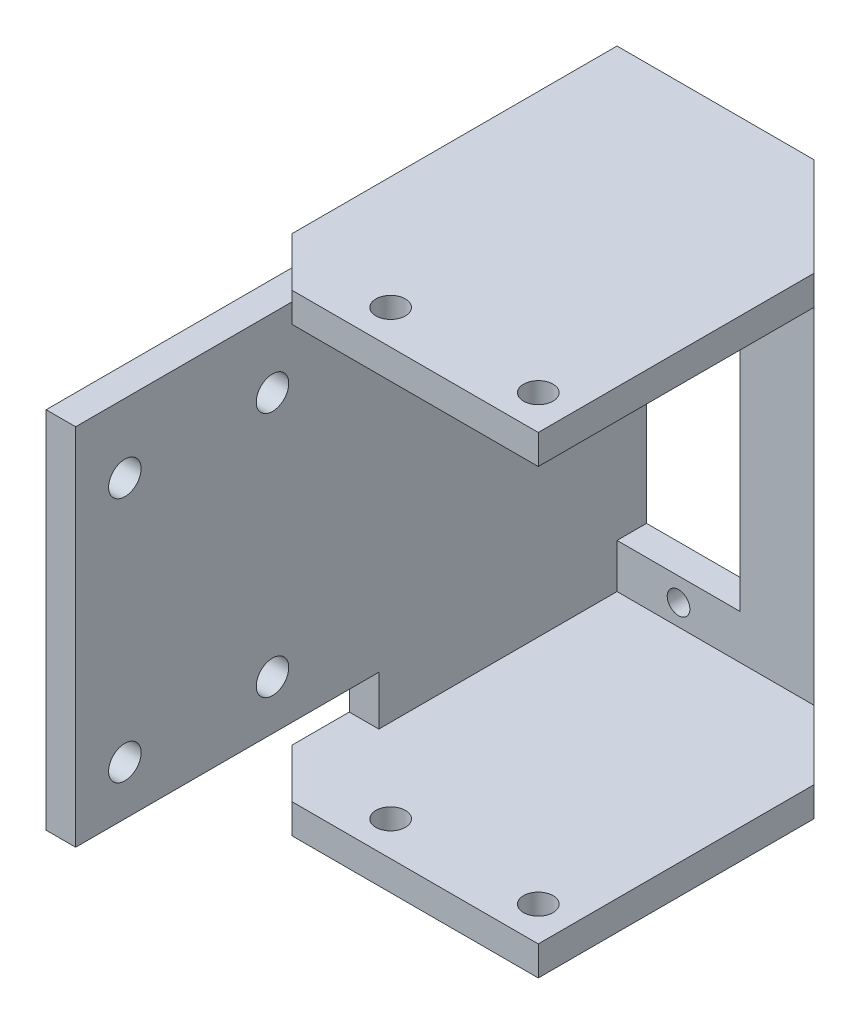
ISO-10303-21;
HEADER;
FILE_DESCRIPTION(('STEP AP214'),'2;1');
FILE_NAME('part.step','',(''),(''),'','','');
FILE_SCHEMA(('AUTOMOTIVE_DESIGN { 1 0 10303 214 1 1 1 1 }'));
ENDSEC;
DATA;
#1=APPLICATION_CONTEXT('core data for automotive mechanical design processes');
#2=APPLICATION_PROTOCOL_DEFINITION('international standard','automotive_design',2000,#1);
#3=PRODUCT_CONTEXT('',#1,'mechanical');
#4=PRODUCT('Part','Part','',(#3));
#5=PRODUCT_RELATED_PRODUCT_CATEGORY('part','',(#4));
#6=PRODUCT_DEFINITION_FORMATION('','',#4);
#7=PRODUCT_DEFINITION_CONTEXT('part definition',#1,'design');
#8=PRODUCT_DEFINITION('design','',#6,#7);
#9=PRODUCT_DEFINITION_SHAPE('','',#8);
#10=(LENGTH_UNIT() NAMED_UNIT(*) SI_UNIT(.MILLI.,.METRE.));
#11=(NAMED_UNIT(*) PLANE_ANGLE_UNIT() SI_UNIT($,.RADIAN.));
#12=(NAMED_UNIT(*) SI_UNIT($,.STERADIAN.) SOLID_ANGLE_UNIT());
#13=UNCERTAINTY_MEASURE_WITH_UNIT(LENGTH_MEASURE(1.E-05),#10,'distance_accuracy_value','');
#14=(GEOMETRIC_REPRESENTATION_CONTEXT(3) GLOBAL_UNCERTAINTY_ASSIGNED_CONTEXT((#13)) GLOBAL_UNIT_ASSIGNED_CONTEXT((#10,
#11,#12)) REPRESENTATION_CONTEXT('',''));
#15=CARTESIAN_POINT('',(0.,0.,0.));
#16=DIRECTION('',(0.,0.,1.));
#17=DIRECTION('',(1.,0.,0.));
#18=AXIS2_PLACEMENT_3D('',#15,#16,#17);
#19=CARTESIAN_POINT('',(0.,0.,3.));
#20=DIRECTION('',(0.,0.,-1.));
#21=DIRECTION('',(-1.,0.,0.));
#22=AXIS2_PLACEMENT_3D('',#19,#20,#21);
#23=PLANE('',#22);
#24=DIRECTION('',(0.,1.,0.));
#25=VECTOR('',#24,1.);
#26=CARTESIAN_POINT('',(15.5,7.49999999999995,3.));
#27=LINE('',#26,#25);
#28=CARTESIAN_POINT('',(15.5,7.49999999999995,3.));
#29=VERTEX_POINT('',#28);
#30=CARTESIAN_POINT('',(15.5,30.4999999999999,3.));
#31=VERTEX_POINT('',#30);
#32=EDGE_CURVE('E278',#29,#31,#27,.T.);
#33=ORIENTED_EDGE('',*,*,#32,.F.);
#34=DIRECTION('',(1.,0.,0.));
#35=VECTOR('',#34,1.);
#36=CARTESIAN_POINT('',(15.5,7.49999999999995,3.));
#37=LINE('',#36,#35);
#38=CARTESIAN_POINT('',(3.00000000000008,7.49999999999995,3.));
#39=VERTEX_POINT('',#38);
#40=EDGE_CURVE('E285',#39,#29,#37,.T.);
#41=ORIENTED_EDGE('',*,*,#40,.F.);
#42=DIRECTION('',(0.,1.,0.));
#43=VECTOR('',#42,1.);
#44=CARTESIAN_POINT('',(3.00000000000008,3.,3.));
#45=LINE('',#44,#43);
#46=CARTESIAN_POINT('',(3.00000000000008,3.,3.));
#47=VERTEX_POINT('',#46);
#48=EDGE_CURVE('E331',#47,#39,#45,.T.);
#49=ORIENTED_EDGE('',*,*,#48,.F.);
#50=DIRECTION('',(-1.,0.,0.));
#51=VECTOR('',#50,1.);
#52=CARTESIAN_POINT('',(0.,3.,3.));
#53=LINE('',#52,#51);
#54=CARTESIAN_POINT('',(22.9999999999999,3.,3.));
#55=VERTEX_POINT('',#54);
#56=EDGE_CURVE('E386',#55,#47,#53,.T.);
#57=ORIENTED_EDGE('',*,*,#56,.F.);
#58=DIRECTION('',(0.,1.,0.));
#59=VECTOR('',#58,1.);
#60=CARTESIAN_POINT('',(22.9999999999999,0.,3.));
#61=LINE('',#60,#59);
#62=CARTESIAN_POINT('',(22.9999999999999,45.,3.));
#63=VERTEX_POINT('',#62);
#64=EDGE_CURVE('E348',#55,#63,#61,.T.);
#65=ORIENTED_EDGE('',*,*,#64,.T.);
#66=DIRECTION('',(1.,0.,0.));
#67=VECTOR('',#66,1.);
#68=CARTESIAN_POINT('',(0.,45.,3.));
#69=LINE('',#68,#67);
#70=CARTESIAN_POINT('',(3.00000000000008,45.,3.));
#71=VERTEX_POINT('',#70);
#72=EDGE_CURVE('E378',#71,#63,#69,.T.);
#73=ORIENTED_EDGE('',*,*,#72,.F.);
#74=CARTESIAN_POINT('',(3.00000000000008,30.4999999999999,3.));
#75=VERTEX_POINT('',#74);
#76=EDGE_CURVE('E330',#75,#71,#45,.T.);
#77=ORIENTED_EDGE('',*,*,#76,.F.);
#78=DIRECTION('',(-1.,0.,0.));
#79=VECTOR('',#78,1.);
#80=CARTESIAN_POINT('',(15.5,30.4999999999999,3.));
#81=LINE('',#80,#79);
#82=EDGE_CURVE('E283',#31,#75,#81,.T.);
#83=ORIENTED_EDGE('',*,*,#82,.F.);
#84=EDGE_LOOP('',(#33,#41,#49,#57,#65,#73,#77,#83));
#85=FACE_BOUND('',#84,.T.);
#86=CARTESIAN_POINT('',(9.24999999999998,32.85,3.));
#87=DIRECTION('',(0.,0.,1.));
#88=DIRECTION('',(1.,0.,0.));
#89=AXIS2_PLACEMENT_3D('',#86,#87,#88);
#90=CIRCLE('',#89,1.15);
#91=CARTESIAN_POINT('',(10.4,32.85,3.));
#92=VERTEX_POINT('',#91);
#93=EDGE_CURVE('E275',#92,#92,#90,.T.);
#94=ORIENTED_EDGE('',*,*,#93,.F.);
#95=EDGE_LOOP('',(#94));
#96=FACE_BOUND('',#95,.T.);
#97=CARTESIAN_POINT('',(9.24999999999998,5.14999999999995,3.));
#98=DIRECTION('',(0.,0.,1.));
#99=DIRECTION('',(1.,0.,0.));
#100=AXIS2_PLACEMENT_3D('',#97,#98,#99);
#101=CIRCLE('',#100,1.15);
#102=CARTESIAN_POINT('',(10.4,5.14999999999995,3.));
#103=VERTEX_POINT('',#102);
#104=EDGE_CURVE('E274',#103,#103,#101,.T.);
#105=ORIENTED_EDGE('',*,*,#104,.F.);
#106=EDGE_LOOP('',(#105));
#107=FACE_BOUND('',#106,.T.);
#108=DIRECTION('',(0.,-1.,0.));
#109=VECTOR('',#108,1.);
#110=CARTESIAN_POINT('',(6.37375600474519,35.5569230144234,3.));
#111=LINE('',#110,#109);
#112=CARTESIAN_POINT('',(6.37375600474519,40.231274425459,3.));
#113=VERTEX_POINT('',#112);
#114=CARTESIAN_POINT('',(6.37375600474519,35.5569230144234,3.));
#115=VERTEX_POINT('',#114);
#116=EDGE_CURVE('E226',#113,#115,#111,.T.);
#117=ORIENTED_EDGE('',*,*,#116,.F.);
#118=DIRECTION('',(-1.,0.,0.));
#119=VECTOR('',#118,1.);
#120=CARTESIAN_POINT('',(6.37375600474519,40.231274425459,3.));
#121=LINE('',#120,#119);
#122=CARTESIAN_POINT('',(11.928177846488,40.231274425459,3.));
#123=VERTEX_POINT('',#122);
#124=EDGE_CURVE('E223',#123,#113,#121,.T.);
#125=ORIENTED_EDGE('',*,*,#124,.F.);
#126=DIRECTION('',(0.,1.,0.));
#127=VECTOR('',#126,1.);
#128=CARTESIAN_POINT('',(11.928177846488,35.5569230144234,3.));
#129=LINE('',#128,#127);
#130=CARTESIAN_POINT('',(11.928177846488,35.5569230144234,3.));
#131=VERTEX_POINT('',#130);
#132=EDGE_CURVE('E61',#131,#123,#129,.T.);
#133=ORIENTED_EDGE('',*,*,#132,.F.);
#134=DIRECTION('',(1.,0.,0.));
#135=VECTOR('',#134,1.);
#136=CARTESIAN_POINT('',(6.37375600474519,35.5569230144234,3.));
#137=LINE('',#136,#135);
#138=EDGE_CURVE('E56',#115,#131,#137,.T.);
#139=ORIENTED_EDGE('',*,*,#138,.F.);
#140=EDGE_LOOP('',(#117,#125,#133,#139));
#141=FACE_BOUND('',#140,.T.);
#142=ADVANCED_FACE('F41',(#85,#96,#107,#141),#23,.F.);
#143=CARTESIAN_POINT('',(0.,3.,38.));
#144=DIRECTION('',(0.,-1.,0.));
#145=DIRECTION('',(0.,0.,-1.));
#146=AXIS2_PLACEMENT_3D('',#143,#144,#145);
#147=PLANE('',#146);
#148=CARTESIAN_POINT('',(26.5,3.,34.5));
#149=DIRECTION('',(0.,-1.,0.));
#150=DIRECTION('',(0.,0.,-1.));
#151=AXIS2_PLACEMENT_3D('',#148,#149,#150);
#152=CIRCLE('',#151,1.5);
#153=CARTESIAN_POINT('',(26.5,3.,33.));
#154=VERTEX_POINT('',#153);
#155=EDGE_CURVE('E256',#154,#154,#152,.T.);
#156=ORIENTED_EDGE('',*,*,#155,.T.);
#157=EDGE_LOOP('',(#156));
#158=FACE_BOUND('',#157,.T.);
#159=CARTESIAN_POINT('',(11.5,3.,34.5000000000003));
#160=DIRECTION('',(0.,-1.,0.));
#161=DIRECTION('',(0.,0.,-1.));
#162=AXIS2_PLACEMENT_3D('',#159,#160,#161);
#163=CIRCLE('',#162,1.5);
#164=CARTESIAN_POINT('',(11.5,3.,33.0000000000002));
#165=VERTEX_POINT('',#164);
#166=EDGE_CURVE('E250',#165,#165,#163,.T.);
#167=ORIENTED_EDGE('',*,*,#166,.T.);
#168=EDGE_LOOP('',(#167));
#169=FACE_BOUND('',#168,.T.);
#170=DIRECTION('',(0.,0.,-1.));
#171=VECTOR('',#170,1.);
#172=CARTESIAN_POINT('',(3.00000000000008,3.,28.));
#173=LINE('',#172,#171);
#174=CARTESIAN_POINT('',(3.00000000000008,3.,27.2));
#175=VERTEX_POINT('',#174);
#176=EDGE_CURVE('E337',#175,#47,#173,.T.);
#177=ORIENTED_EDGE('',*,*,#176,.F.);
#178=DIRECTION('',(-1.,0.,0.));
#179=VECTOR('',#178,1.);
#180=CARTESIAN_POINT('',(10.,3.,27.2));
#181=LINE('',#180,#179);
#182=CARTESIAN_POINT('',(0.,3.,27.2));
#183=VERTEX_POINT('',#182);
#184=EDGE_CURVE('E268',#175,#183,#181,.T.);
#185=ORIENTED_EDGE('',*,*,#184,.T.);
#186=DIRECTION('',(0.,0.,1.));
#187=VECTOR('',#186,1.);
#188=CARTESIAN_POINT('',(0.,3.,58.));
#189=LINE('',#188,#187);
#190=CARTESIAN_POINT('',(0.,3.,33.));
#191=VERTEX_POINT('',#190);
#192=EDGE_CURVE('E265',#183,#191,#189,.T.);
#193=ORIENTED_EDGE('',*,*,#192,.T.);
#194=DIRECTION('',(0.707106781186544,0.,0.707106781186551));
#195=VECTOR('',#194,1.);
#196=CARTESIAN_POINT('',(2.50000000000003,3.,35.5));
#197=LINE('',#196,#195);
#198=CARTESIAN_POINT('',(5.,3.,38.));
#199=VERTEX_POINT('',#198);
#200=EDGE_CURVE('E371',#191,#199,#197,.T.);
#201=ORIENTED_EDGE('',*,*,#200,.T.);
#202=DIRECTION('',(-1.,0.,0.));
#203=VECTOR('',#202,1.);
#204=CARTESIAN_POINT('',(0.,3.,38.));
#205=LINE('',#204,#203);
#206=CARTESIAN_POINT('',(30.,3.,38.));
#207=VERTEX_POINT('',#206);
#208=EDGE_CURVE('E392',#207,#199,#205,.T.);
#209=ORIENTED_EDGE('',*,*,#208,.F.);
#210=DIRECTION('',(0.,0.,-1.));
#211=VECTOR('',#210,1.);
#212=CARTESIAN_POINT('',(30.,3.,38.));
#213=LINE('',#212,#211);
#214=CARTESIAN_POINT('',(30.,3.,10.));
#215=VERTEX_POINT('',#214);
#216=EDGE_CURVE('E374',#207,#215,#213,.T.);
#217=ORIENTED_EDGE('',*,*,#216,.T.);
#218=DIRECTION('',(-0.707106781186551,0.,-0.707106781186544));
#219=VECTOR('',#218,1.);
#220=CARTESIAN_POINT('',(28.9999999999998,3.,8.99999999999986));
#221=LINE('',#220,#219);
#222=EDGE_CURVE('E353',#215,#55,#221,.T.);
#223=ORIENTED_EDGE('',*,*,#222,.T.);
#224=ORIENTED_EDGE('',*,*,#56,.T.);
#225=EDGE_LOOP('',(#177,#185,#193,#201,#209,#217,#223,#224));
#226=FACE_BOUND('',#225,.T.);
#227=ADVANCED_FACE('F491',(#158,#169,#226),#147,.F.);
#228=CARTESIAN_POINT('',(0.,45.,38.));
#229=DIRECTION('',(0.,1.,0.));
#230=DIRECTION('',(0.,0.,1.));
#231=AXIS2_PLACEMENT_3D('',#228,#229,#230);
#232=PLANE('',#231);
#233=CARTESIAN_POINT('',(26.5,45.,34.5));
#234=DIRECTION('',(0.,1.,0.));
#235=DIRECTION('',(0.,0.,1.));
#236=AXIS2_PLACEMENT_3D('',#233,#234,#235);
#237=CIRCLE('',#236,1.5);
#238=CARTESIAN_POINT('',(26.5,45.,36.));
#239=VERTEX_POINT('',#238);
#240=EDGE_CURVE('E253',#239,#239,#237,.T.);
#241=ORIENTED_EDGE('',*,*,#240,.T.);
#242=EDGE_LOOP('',(#241));
#243=FACE_BOUND('',#242,.T.);
#244=CARTESIAN_POINT('',(11.5,45.,34.5000000000003));
#245=DIRECTION('',(0.,1.,0.));
#246=DIRECTION('',(0.,0.,1.));
#247=AXIS2_PLACEMENT_3D('',#244,#245,#246);
#248=CIRCLE('',#247,1.5);
#249=CARTESIAN_POINT('',(11.5,45.,36.0000000000003));
#250=VERTEX_POINT('',#249);
#251=EDGE_CURVE('E239',#250,#250,#248,.T.);
#252=ORIENTED_EDGE('',*,*,#251,.T.);
#253=EDGE_LOOP('',(#252));
#254=FACE_BOUND('',#253,.T.);
#255=DIRECTION('',(-0.707106781186544,0.,-0.707106781186551));
#256=VECTOR('',#255,1.);
#257=CARTESIAN_POINT('',(2.50000000000003,45.,35.5));
#258=LINE('',#257,#256);
#259=CARTESIAN_POINT('',(5.,45.,38.));
#260=VERTEX_POINT('',#259);
#261=CARTESIAN_POINT('',(3.00000000000008,45.,36.0000000000001));
#262=VERTEX_POINT('',#261);
#263=EDGE_CURVE('E365',#260,#262,#258,.T.);
#264=ORIENTED_EDGE('',*,*,#263,.T.);
#265=DIRECTION('',(0.,0.,-1.));
#266=VECTOR('',#265,1.);
#267=CARTESIAN_POINT('',(3.00000000000008,45.,28.));
#268=LINE('',#267,#266);
#269=EDGE_CURVE('E334',#262,#71,#268,.T.);
#270=ORIENTED_EDGE('',*,*,#269,.T.);
#271=ORIENTED_EDGE('',*,*,#72,.T.);
#272=DIRECTION('',(0.707106781186551,0.,0.707106781186544));
#273=VECTOR('',#272,1.);
#274=CARTESIAN_POINT('',(28.9999999999998,45.,8.99999999999986));
#275=LINE('',#274,#273);
#276=CARTESIAN_POINT('',(30.,45.,10.));
#277=VERTEX_POINT('',#276);
#278=EDGE_CURVE('E418',#63,#277,#275,.T.);
#279=ORIENTED_EDGE('',*,*,#278,.T.);
#280=DIRECTION('',(0.,0.,-1.));
#281=VECTOR('',#280,1.);
#282=CARTESIAN_POINT('',(30.,45.,38.));
#283=LINE('',#282,#281);
#284=CARTESIAN_POINT('',(30.,45.,38.));
#285=VERTEX_POINT('',#284);
#286=EDGE_CURVE('E384',#285,#277,#283,.T.);
#287=ORIENTED_EDGE('',*,*,#286,.F.);
#288=DIRECTION('',(1.,0.,0.));
#289=VECTOR('',#288,1.);
#290=CARTESIAN_POINT('',(0.,45.,38.));
#291=LINE('',#290,#289);
#292=EDGE_CURVE('E375',#260,#285,#291,.T.);
#293=ORIENTED_EDGE('',*,*,#292,.F.);
#294=EDGE_LOOP('',(#264,#270,#271,#279,#287,#293));
#295=FACE_BOUND('',#294,.T.);
#296=ADVANCED_FACE('F501',(#243,#254,#295),#232,.F.);
#297=CARTESIAN_POINT('',(30.,0.,3.));
#298=DIRECTION('',(-1.,0.,0.));
#299=DIRECTION('',(0.,-1.,0.));
#300=AXIS2_PLACEMENT_3D('',#297,#298,#299);
#301=PLANE('',#300);
#302=DIRECTION('',(0.,0.,-1.));
#303=VECTOR('',#302,1.);
#304=CARTESIAN_POINT('',(30.,0.,3.));
#305=LINE('',#304,#303);
#306=CARTESIAN_POINT('',(30.,0.,38.));
#307=VERTEX_POINT('',#306);
#308=CARTESIAN_POINT('',(30.,0.,10.));
#309=VERTEX_POINT('',#308);
#310=EDGE_CURVE('E413',#307,#309,#305,.T.);
#311=ORIENTED_EDGE('',*,*,#310,.T.);
#312=DIRECTION('',(0.,-1.,0.));
#313=VECTOR('',#312,1.);
#314=CARTESIAN_POINT('',(30.,48.,10.));
#315=LINE('',#314,#313);
#316=EDGE_CURVE('E343',#215,#309,#315,.T.);
#317=ORIENTED_EDGE('',*,*,#316,.F.);
#318=ORIENTED_EDGE('',*,*,#216,.F.);
#319=DIRECTION('',(0.,1.,0.));
#320=VECTOR('',#319,1.);
#321=CARTESIAN_POINT('',(30.,0.,38.));
#322=LINE('',#321,#320);
#323=EDGE_CURVE('E397',#307,#207,#322,.T.);
#324=ORIENTED_EDGE('',*,*,#323,.F.);
#325=EDGE_LOOP('',(#311,#317,#318,#324));
#326=FACE_BOUND('',#325,.T.);
#327=ADVANCED_FACE('F520',(#326),#301,.F.);
#328=CARTESIAN_POINT('',(0.,0.,3.));
#329=DIRECTION('',(1.,0.,0.));
#330=DIRECTION('',(0.,1.,0.));
#331=AXIS2_PLACEMENT_3D('',#328,#329,#330);
#332=PLANE('',#331);
#333=CARTESIAN_POINT('',(0.,13.,53.));
#334=DIRECTION('',(-1.,0.,0.));
#335=DIRECTION('',(0.,-1.,0.));
#336=AXIS2_PLACEMENT_3D('',#333,#334,#335);
#337=CIRCLE('',#336,1.65);
#338=CARTESIAN_POINT('',(0.,11.35,53.));
#339=VERTEX_POINT('',#338);
#340=EDGE_CURVE('E305',#339,#339,#337,.T.);
#341=ORIENTED_EDGE('',*,*,#340,.F.);
#342=EDGE_LOOP('',(#341));
#343=FACE_BOUND('',#342,.T.);
#344=CARTESIAN_POINT('',(0.,38.,52.9999999999998));
#345=DIRECTION('',(-1.,0.,0.));
#346=DIRECTION('',(0.,-1.,0.));
#347=AXIS2_PLACEMENT_3D('',#344,#345,#346);
#348=CIRCLE('',#347,1.65);
#349=CARTESIAN_POINT('',(0.,36.35,52.9999999999998));
#350=VERTEX_POINT('',#349);
#351=EDGE_CURVE('E302',#350,#350,#348,.T.);
#352=ORIENTED_EDGE('',*,*,#351,.F.);
#353=EDGE_LOOP('',(#352));
#354=FACE_BOUND('',#353,.T.);
#355=CARTESIAN_POINT('',(0.,37.9999999999999,37.9999999999998));
#356=DIRECTION('',(-1.,0.,0.));
#357=DIRECTION('',(0.,-1.,0.));
#358=AXIS2_PLACEMENT_3D('',#355,#356,#357);
#359=CIRCLE('',#358,1.65);
#360=CARTESIAN_POINT('',(0.,36.3499999999999,37.9999999999998));
#361=VERTEX_POINT('',#360);
#362=EDGE_CURVE('E298',#361,#361,#359,.T.);
#363=ORIENTED_EDGE('',*,*,#362,.F.);
#364=EDGE_LOOP('',(#363));
#365=FACE_BOUND('',#364,.T.);
#366=CARTESIAN_POINT('',(0.,12.9999999999999,38.));
#367=DIRECTION('',(-1.,0.,0.));
#368=DIRECTION('',(0.,-1.,0.));
#369=AXIS2_PLACEMENT_3D('',#366,#367,#368);
#370=CIRCLE('',#369,1.65);
#371=CARTESIAN_POINT('',(0.,11.3499999999999,38.));
#372=VERTEX_POINT('',#371);
#373=EDGE_CURVE('E301',#372,#372,#370,.T.);
#374=ORIENTED_EDGE('',*,*,#373,.F.);
#375=EDGE_LOOP('',(#374));
#376=FACE_BOUND('',#375,.T.);
#377=DIRECTION('',(0.,-1.,0.));
#378=VECTOR('',#377,1.);
#379=CARTESIAN_POINT('',(0.,48.,33.));
#380=LINE('',#379,#378);
#381=CARTESIAN_POINT('',(0.,0.,33.));
#382=VERTEX_POINT('',#381);
#383=EDGE_CURVE('E360',#191,#382,#380,.T.);
#384=ORIENTED_EDGE('',*,*,#383,.F.);
#385=ORIENTED_EDGE('',*,*,#192,.F.);
#386=DIRECTION('',(0.,-1.,0.));
#387=VECTOR('',#386,1.);
#388=CARTESIAN_POINT('',(0.,3.,27.2));
#389=LINE('',#388,#387);
#390=CARTESIAN_POINT('',(0.,8.00000000000001,27.2));
#391=VERTEX_POINT('',#390);
#392=EDGE_CURVE('E262',#391,#183,#389,.T.);
#393=ORIENTED_EDGE('',*,*,#392,.F.);
#394=DIRECTION('',(0.,0.,-1.));
#395=VECTOR('',#394,1.);
#396=CARTESIAN_POINT('',(0.,8.00000000000001,58.));
#397=LINE('',#396,#395);
#398=CARTESIAN_POINT('',(0.,8.00000000000001,58.));
#399=VERTEX_POINT('',#398);
#400=EDGE_CURVE('E259',#399,#391,#397,.T.);
#401=ORIENTED_EDGE('',*,*,#400,.F.);
#402=DIRECTION('',(0.,-1.,0.));
#403=VECTOR('',#402,1.);
#404=CARTESIAN_POINT('',(0.,45.,58.));
#405=LINE('',#404,#403);
#406=CARTESIAN_POINT('',(0.,45.,58.));
#407=VERTEX_POINT('',#406);
#408=EDGE_CURVE('E315',#407,#399,#405,.T.);
#409=ORIENTED_EDGE('',*,*,#408,.F.);
#410=DIRECTION('',(0.,0.,-1.));
#411=VECTOR('',#410,1.);
#412=CARTESIAN_POINT('',(0.,45.,58.));
#413=LINE('',#412,#411);
#414=CARTESIAN_POINT('',(0.,45.,33.));
#415=VERTEX_POINT('',#414);
#416=EDGE_CURVE('E324',#407,#415,#413,.T.);
#417=ORIENTED_EDGE('',*,*,#416,.T.);
#418=CARTESIAN_POINT('',(0.,48.,33.));
#419=VERTEX_POINT('',#418);
#420=EDGE_CURVE('E367',#419,#415,#380,.T.);
#421=ORIENTED_EDGE('',*,*,#420,.F.);
#422=DIRECTION('',(0.,0.,-1.));
#423=VECTOR('',#422,1.);
#424=CARTESIAN_POINT('',(0.,48.,3.));
#425=LINE('',#424,#423);
#426=CARTESIAN_POINT('',(0.,48.,0.));
#427=VERTEX_POINT('',#426);
#428=EDGE_CURVE('E407',#419,#427,#425,.T.);
#429=ORIENTED_EDGE('',*,*,#428,.T.);
#430=DIRECTION('',(0.,-1.,0.));
#431=VECTOR('',#430,1.);
#432=CARTESIAN_POINT('',(0.,0.,0.));
#433=LINE('',#432,#431);
#434=CARTESIAN_POINT('',(0.,0.,0.));
#435=VERTEX_POINT('',#434);
#436=EDGE_CURVE('E389',#427,#435,#433,.T.);
#437=ORIENTED_EDGE('',*,*,#436,.T.);
#438=DIRECTION('',(0.,0.,-1.));
#439=VECTOR('',#438,1.);
#440=CARTESIAN_POINT('',(0.,0.,3.));
#441=LINE('',#440,#439);
#442=EDGE_CURVE('E416',#382,#435,#441,.T.);
#443=ORIENTED_EDGE('',*,*,#442,.F.);
#444=EDGE_LOOP('',(#384,#385,#393,#401,#409,#417,#421,#429,#437,#443));
#445=FACE_BOUND('',#444,.T.);
#446=ADVANCED_FACE('F43',(#343,#354,#365,#376,#445),#332,.F.);
#447=CARTESIAN_POINT('',(0.,0.,3.));
#448=DIRECTION('',(0.,1.,0.));
#449=DIRECTION('',(0.,0.,1.));
#450=AXIS2_PLACEMENT_3D('',#447,#448,#449);
#451=PLANE('',#450);
#452=CARTESIAN_POINT('',(26.5,0.,34.5));
#453=DIRECTION('',(0.,-1.,0.));
#454=DIRECTION('',(0.,0.,-1.));
#455=AXIS2_PLACEMENT_3D('',#452,#453,#454);
#456=CIRCLE('',#455,1.5);
#457=CARTESIAN_POINT('',(26.5,0.,33.));
#458=VERTEX_POINT('',#457);
#459=EDGE_CURVE('E240',#458,#458,#456,.T.);
#460=ORIENTED_EDGE('',*,*,#459,.F.);
#461=EDGE_LOOP('',(#460));
#462=FACE_BOUND('',#461,.T.);
#463=CARTESIAN_POINT('',(11.5,0.,34.5000000000003));
#464=DIRECTION('',(0.,-1.,0.));
#465=DIRECTION('',(0.,0.,-1.));
#466=AXIS2_PLACEMENT_3D('',#463,#464,#465);
#467=CIRCLE('',#466,1.5);
#468=CARTESIAN_POINT('',(11.5,0.,33.0000000000002));
#469=VERTEX_POINT('',#468);
#470=EDGE_CURVE('E243',#469,#469,#467,.T.);
#471=ORIENTED_EDGE('',*,*,#470,.F.);
#472=EDGE_LOOP('',(#471));
#473=FACE_BOUND('',#472,.T.);
#474=DIRECTION('',(1.,0.,0.));
#475=VECTOR('',#474,1.);
#476=CARTESIAN_POINT('',(0.,0.,0.));
#477=LINE('',#476,#475);
#478=CARTESIAN_POINT('',(19.9999999999999,0.,0.));
#479=VERTEX_POINT('',#478);
#480=EDGE_CURVE('E402',#435,#479,#477,.T.);
#481=ORIENTED_EDGE('',*,*,#480,.T.);
#482=DIRECTION('',(-0.707106781186551,0.,-0.707106781186544));
#483=VECTOR('',#482,1.);
#484=CARTESIAN_POINT('',(19.9999999999999,0.,0.));
#485=LINE('',#484,#483);
#486=EDGE_CURVE('E339',#309,#479,#485,.T.);
#487=ORIENTED_EDGE('',*,*,#486,.F.);
#488=ORIENTED_EDGE('',*,*,#310,.F.);
#489=DIRECTION('',(1.,0.,0.));
#490=VECTOR('',#489,1.);
#491=CARTESIAN_POINT('',(0.,0.,38.));
#492=LINE('',#491,#490);
#493=CARTESIAN_POINT('',(5.,0.,38.));
#494=VERTEX_POINT('',#493);
#495=EDGE_CURVE('E395',#494,#307,#492,.T.);
#496=ORIENTED_EDGE('',*,*,#495,.F.);
#497=DIRECTION('',(0.707106781186544,0.,0.707106781186551));
#498=VECTOR('',#497,1.);
#499=CARTESIAN_POINT('',(0.,0.,33.));
#500=LINE('',#499,#498);
#501=EDGE_CURVE('E356',#382,#494,#500,.T.);
#502=ORIENTED_EDGE('',*,*,#501,.F.);
#503=ORIENTED_EDGE('',*,*,#442,.T.);
#504=EDGE_LOOP('',(#481,#487,#488,#496,#502,#503));
#505=FACE_BOUND('',#504,.T.);
#506=ADVANCED_FACE('F475',(#462,#473,#505),#451,.F.);
#507=ORIENTED_EDGE('',*,*,#286,.T.);
#508=CARTESIAN_POINT('',(30.,48.,10.));
#509=VERTEX_POINT('',#508);
#510=EDGE_CURVE('E349',#509,#277,#315,.T.);
#511=ORIENTED_EDGE('',*,*,#510,.F.);
#512=DIRECTION('',(0.,0.,-1.));
#513=VECTOR('',#512,1.);
#514=CARTESIAN_POINT('',(30.,48.,3.));
#515=LINE('',#514,#513);
#516=CARTESIAN_POINT('',(30.,48.,38.));
#517=VERTEX_POINT('',#516);
#518=EDGE_CURVE('E410',#517,#509,#515,.T.);
#519=ORIENTED_EDGE('',*,*,#518,.F.);
#520=DIRECTION('',(0.,1.,0.));
#521=VECTOR('',#520,1.);
#522=CARTESIAN_POINT('',(30.,48.,38.));
#523=LINE('',#522,#521);
#524=EDGE_CURVE('E377',#285,#517,#523,.T.);
#525=ORIENTED_EDGE('',*,*,#524,.F.);
#526=EDGE_LOOP('',(#507,#511,#519,#525));
#527=FACE_BOUND('',#526,.T.);
#528=ADVANCED_FACE('F508',(#527),#301,.F.);
#529=CARTESIAN_POINT('',(0.,48.,3.));
#530=DIRECTION('',(0.,-1.,0.));
#531=DIRECTION('',(0.,0.,-1.));
#532=AXIS2_PLACEMENT_3D('',#529,#530,#531);
#533=PLANE('',#532);
#534=CARTESIAN_POINT('',(26.5,48.,34.5));
#535=DIRECTION('',(0.,-1.,0.));
#536=DIRECTION('',(0.,0.,-1.));
#537=AXIS2_PLACEMENT_3D('',#534,#535,#536);
#538=CIRCLE('',#537,1.5);
#539=CARTESIAN_POINT('',(26.5,48.,33.));
#540=VERTEX_POINT('',#539);
#541=EDGE_CURVE('E236',#540,#540,#538,.T.);
#542=ORIENTED_EDGE('',*,*,#541,.T.);
#543=EDGE_LOOP('',(#542));
#544=FACE_BOUND('',#543,.T.);
#545=CARTESIAN_POINT('',(11.5,48.,34.5000000000003));
#546=DIRECTION('',(0.,-1.,0.));
#547=DIRECTION('',(0.,0.,-1.));
#548=AXIS2_PLACEMENT_3D('',#545,#546,#547);
#549=CIRCLE('',#548,1.5);
#550=CARTESIAN_POINT('',(11.5,48.,33.0000000000002));
#551=VERTEX_POINT('',#550);
#552=EDGE_CURVE('E230',#551,#551,#549,.T.);
#553=ORIENTED_EDGE('',*,*,#552,.T.);
#554=EDGE_LOOP('',(#553));
#555=FACE_BOUND('',#554,.T.);
#556=ORIENTED_EDGE('',*,*,#518,.T.);
#557=DIRECTION('',(-0.707106781186551,0.,-0.707106781186544));
#558=VECTOR('',#557,1.);
#559=CARTESIAN_POINT('',(19.9999999999999,48.,0.));
#560=LINE('',#559,#558);
#561=CARTESIAN_POINT('',(19.9999999999999,48.,0.));
#562=VERTEX_POINT('',#561);
#563=EDGE_CURVE('E340',#509,#562,#560,.T.);
#564=ORIENTED_EDGE('',*,*,#563,.T.);
#565=DIRECTION('',(-1.,0.,0.));
#566=VECTOR('',#565,1.);
#567=CARTESIAN_POINT('',(0.,48.,0.));
#568=LINE('',#567,#566);
#569=EDGE_CURVE('E405',#562,#427,#568,.T.);
#570=ORIENTED_EDGE('',*,*,#569,.T.);
#571=ORIENTED_EDGE('',*,*,#428,.F.);
#572=DIRECTION('',(0.707106781186544,0.,0.707106781186551));
#573=VECTOR('',#572,1.);
#574=CARTESIAN_POINT('',(0.,48.,33.));
#575=LINE('',#574,#573);
#576=CARTESIAN_POINT('',(5.,48.,38.));
#577=VERTEX_POINT('',#576);
#578=EDGE_CURVE('E357',#419,#577,#575,.T.);
#579=ORIENTED_EDGE('',*,*,#578,.T.);
#580=DIRECTION('',(-1.,0.,0.));
#581=VECTOR('',#580,1.);
#582=CARTESIAN_POINT('',(0.,48.,38.));
#583=LINE('',#582,#581);
#584=EDGE_CURVE('E381',#517,#577,#583,.T.);
#585=ORIENTED_EDGE('',*,*,#584,.F.);
#586=EDGE_LOOP('',(#556,#564,#570,#571,#579,#585));
#587=FACE_BOUND('',#586,.T.);
#588=ADVANCED_FACE('F466',(#544,#555,#587),#533,.F.);
#589=CARTESIAN_POINT('',(0.,0.,0.));
#590=DIRECTION('',(0.,0.,-1.));
#591=DIRECTION('',(-1.,0.,0.));
#592=AXIS2_PLACEMENT_3D('',#589,#590,#591);
#593=PLANE('',#592);
#594=CARTESIAN_POINT('',(9.25,37.75,0.));
#595=DIRECTION('',(0.,0.,-1.));
#596=DIRECTION('',(-1.,0.,0.));
#597=AXIS2_PLACEMENT_3D('',#594,#595,#596);
#598=CIRCLE('',#597,2.);
#599=CARTESIAN_POINT('',(7.25,37.75,0.));
#600=VERTEX_POINT('',#599);
#601=EDGE_CURVE('E227',#600,#600,#598,.T.);
#602=ORIENTED_EDGE('',*,*,#601,.F.);
#603=EDGE_LOOP('',(#602));
#604=FACE_BOUND('',#603,.T.);
#605=CARTESIAN_POINT('',(9.24999999999998,5.14999999999995,0.));
#606=DIRECTION('',(0.,0.,-1.));
#607=DIRECTION('',(-1.,0.,0.));
#608=AXIS2_PLACEMENT_3D('',#605,#606,#607);
#609=CIRCLE('',#608,1.15);
#610=CARTESIAN_POINT('',(8.09999999999997,5.14999999999995,0.));
#611=VERTEX_POINT('',#610);
#612=EDGE_CURVE('E308',#611,#611,#609,.T.);
#613=ORIENTED_EDGE('',*,*,#612,.F.);
#614=EDGE_LOOP('',(#613));
#615=FACE_BOUND('',#614,.T.);
#616=CARTESIAN_POINT('',(9.24999999999998,32.85,0.));
#617=DIRECTION('',(0.,0.,-1.));
#618=DIRECTION('',(-1.,0.,0.));
#619=AXIS2_PLACEMENT_3D('',#616,#617,#618);
#620=CIRCLE('',#619,1.15);
#621=CARTESIAN_POINT('',(8.09999999999998,32.85,0.));
#622=VERTEX_POINT('',#621);
#623=EDGE_CURVE('E291',#622,#622,#620,.T.);
#624=ORIENTED_EDGE('',*,*,#623,.F.);
#625=EDGE_LOOP('',(#624));
#626=FACE_BOUND('',#625,.T.);
#627=DIRECTION('',(0.,-1.,0.));
#628=VECTOR('',#627,1.);
#629=CARTESIAN_POINT('',(15.5,0.,0.));
#630=LINE('',#629,#628);
#631=CARTESIAN_POINT('',(15.5,30.4999999999999,0.));
#632=VERTEX_POINT('',#631);
#633=CARTESIAN_POINT('',(15.5,7.49999999999995,0.));
#634=VERTEX_POINT('',#633);
#635=EDGE_CURVE('E438',#632,#634,#630,.T.);
#636=ORIENTED_EDGE('',*,*,#635,.F.);
#637=DIRECTION('',(1.,0.,0.));
#638=VECTOR('',#637,1.);
#639=CARTESIAN_POINT('',(0.,30.4999999999999,0.));
#640=LINE('',#639,#638);
#641=CARTESIAN_POINT('',(3.00000000000008,30.4999999999999,0.));
#642=VERTEX_POINT('',#641);
#643=EDGE_CURVE('E421',#642,#632,#640,.T.);
#644=ORIENTED_EDGE('',*,*,#643,.F.);
#645=DIRECTION('',(0.,1.,0.));
#646=VECTOR('',#645,1.);
#647=CARTESIAN_POINT('',(3.00000000000008,0.,0.));
#648=LINE('',#647,#646);
#649=CARTESIAN_POINT('',(3.00000000000008,7.49999999999995,0.));
#650=VERTEX_POINT('',#649);
#651=EDGE_CURVE('E433',#650,#642,#648,.T.);
#652=ORIENTED_EDGE('',*,*,#651,.F.);
#653=DIRECTION('',(-1.,0.,0.));
#654=VECTOR('',#653,1.);
#655=CARTESIAN_POINT('',(0.,7.49999999999995,0.));
#656=LINE('',#655,#654);
#657=EDGE_CURVE('E436',#634,#650,#656,.T.);
#658=ORIENTED_EDGE('',*,*,#657,.F.);
#659=EDGE_LOOP('',(#636,#644,#652,#658));
#660=FACE_BOUND('',#659,.T.);
#661=DIRECTION('',(0.,-1.,0.));
#662=VECTOR('',#661,1.);
#663=CARTESIAN_POINT('',(19.9999999999999,48.,0.));
#664=LINE('',#663,#662);
#665=EDGE_CURVE('E345',#562,#479,#664,.T.);
#666=ORIENTED_EDGE('',*,*,#665,.T.);
#667=ORIENTED_EDGE('',*,*,#480,.F.);
#668=ORIENTED_EDGE('',*,*,#436,.F.);
#669=ORIENTED_EDGE('',*,*,#569,.F.);
#670=EDGE_LOOP('',(#666,#667,#668,#669));
#671=FACE_BOUND('',#670,.T.);
#672=ADVANCED_FACE('F470',(#604,#615,#626,#660,#671),#593,.T.);
#673=CARTESIAN_POINT('',(0.,0.,38.));
#674=DIRECTION('',(0.,0.,-1.));
#675=DIRECTION('',(-1.,0.,0.));
#676=AXIS2_PLACEMENT_3D('',#673,#674,#675);
#677=PLANE('',#676);
#678=ORIENTED_EDGE('',*,*,#208,.T.);
#679=DIRECTION('',(0.,-1.,0.));
#680=VECTOR('',#679,1.);
#681=CARTESIAN_POINT('',(5.,48.,38.));
#682=LINE('',#681,#680);
#683=EDGE_CURVE('E366',#199,#494,#682,.T.);
#684=ORIENTED_EDGE('',*,*,#683,.T.);
#685=ORIENTED_EDGE('',*,*,#495,.T.);
#686=ORIENTED_EDGE('',*,*,#323,.T.);
#687=EDGE_LOOP('',(#678,#684,#685,#686));
#688=FACE_BOUND('',#687,.T.);
#689=ADVANCED_FACE('F485',(#688),#677,.F.);
#690=CARTESIAN_POINT('',(0.,0.,38.));
#691=DIRECTION('',(0.,0.,1.));
#692=DIRECTION('',(1.,0.,0.));
#693=AXIS2_PLACEMENT_3D('',#690,#691,#692);
#694=PLANE('',#693);
#695=EDGE_CURVE('E362',#577,#260,#682,.T.);
#696=ORIENTED_EDGE('',*,*,#695,.T.);
#697=ORIENTED_EDGE('',*,*,#292,.T.);
#698=ORIENTED_EDGE('',*,*,#524,.T.);
#699=ORIENTED_EDGE('',*,*,#584,.T.);
#700=EDGE_LOOP('',(#696,#697,#698,#699));
#701=FACE_BOUND('',#700,.T.);
#702=ADVANCED_FACE('F505',(#701),#694,.T.);
#703=CARTESIAN_POINT('',(0.,48.,33.));
#704=DIRECTION('',(0.707106781186551,0.,-0.707106781186544));
#705=DIRECTION('',(-0.707106781186544,0.,-0.707106781186551));
#706=AXIS2_PLACEMENT_3D('',#703,#704,#705);
#707=PLANE('',#706);
#708=ORIENTED_EDGE('',*,*,#695,.F.);
#709=ORIENTED_EDGE('',*,*,#578,.F.);
#710=ORIENTED_EDGE('',*,*,#420,.T.);
#711=DIRECTION('',(-0.707106781186544,0.,-0.707106781186551));
#712=VECTOR('',#711,1.);
#713=CARTESIAN_POINT('',(0.,45.,33.));
#714=LINE('',#713,#712);
#715=EDGE_CURVE('E327',#262,#415,#714,.T.);
#716=ORIENTED_EDGE('',*,*,#715,.F.);
#717=ORIENTED_EDGE('',*,*,#263,.F.);
#718=EDGE_LOOP('',(#708,#709,#710,#716,#717));
#719=FACE_BOUND('',#718,.T.);
#720=ADVANCED_FACE('F499',(#719),#707,.F.);
#721=ORIENTED_EDGE('',*,*,#383,.T.);
#722=ORIENTED_EDGE('',*,*,#501,.T.);
#723=ORIENTED_EDGE('',*,*,#683,.F.);
#724=ORIENTED_EDGE('',*,*,#200,.F.);
#725=EDGE_LOOP('',(#721,#722,#723,#724));
#726=FACE_BOUND('',#725,.T.);
#727=ADVANCED_FACE('F482',(#726),#707,.F.);
#728=CARTESIAN_POINT('',(19.9999999999999,48.,0.));
#729=DIRECTION('',(-0.707106781186544,0.,0.707106781186551));
#730=DIRECTION('',(0.707106781186551,0.,0.707106781186544));
#731=AXIS2_PLACEMENT_3D('',#728,#729,#730);
#732=PLANE('',#731);
#733=ORIENTED_EDGE('',*,*,#316,.T.);
#734=ORIENTED_EDGE('',*,*,#486,.T.);
#735=ORIENTED_EDGE('',*,*,#665,.F.);
#736=ORIENTED_EDGE('',*,*,#563,.F.);
#737=ORIENTED_EDGE('',*,*,#510,.T.);
#738=ORIENTED_EDGE('',*,*,#278,.F.);
#739=ORIENTED_EDGE('',*,*,#64,.F.);
#740=ORIENTED_EDGE('',*,*,#222,.F.);
#741=EDGE_LOOP('',(#733,#734,#735,#736,#737,#738,#739,#740));
#742=FACE_BOUND('',#741,.T.);
#743=ADVANCED_FACE('F511',(#742),#732,.F.);
#744=CARTESIAN_POINT('',(3.00000000000008,3.,28.));
#745=DIRECTION('',(-1.,0.,0.));
#746=DIRECTION('',(0.,0.,1.));
#747=AXIS2_PLACEMENT_3D('',#744,#745,#746);
#748=PLANE('',#747);
#749=CARTESIAN_POINT('',(3.00000000000008,13.,53.));
#750=DIRECTION('',(-1.,0.,0.));
#751=DIRECTION('',(0.,0.,1.));
#752=AXIS2_PLACEMENT_3D('',#749,#750,#751);
#753=CIRCLE('',#752,1.65);
#754=CARTESIAN_POINT('',(3.00000000000008,13.,54.65));
#755=VERTEX_POINT('',#754);
#756=EDGE_CURVE('E316',#755,#755,#753,.T.);
#757=ORIENTED_EDGE('',*,*,#756,.T.);
#758=EDGE_LOOP('',(#757));
#759=FACE_BOUND('',#758,.T.);
#760=CARTESIAN_POINT('',(3.00000000000008,38.,52.9999999999998));
#761=DIRECTION('',(-1.,0.,0.));
#762=DIRECTION('',(0.,0.,1.));
#763=AXIS2_PLACEMENT_3D('',#760,#761,#762);
#764=CIRCLE('',#763,1.65);
#765=CARTESIAN_POINT('',(3.00000000000008,38.,54.6499999999998));
#766=VERTEX_POINT('',#765);
#767=EDGE_CURVE('E427',#766,#766,#764,.T.);
#768=ORIENTED_EDGE('',*,*,#767,.T.);
#769=EDGE_LOOP('',(#768));
#770=FACE_BOUND('',#769,.T.);
#771=CARTESIAN_POINT('',(3.00000000000008,37.9999999999999,37.9999999999998));
#772=DIRECTION('',(-1.,0.,0.));
#773=DIRECTION('',(0.,0.,1.));
#774=AXIS2_PLACEMENT_3D('',#771,#772,#773);
#775=CIRCLE('',#774,1.65);
#776=CARTESIAN_POINT('',(3.00000000000008,37.9999999999999,39.6499999999998));
#777=VERTEX_POINT('',#776);
#778=EDGE_CURVE('E424',#777,#777,#775,.T.);
#779=ORIENTED_EDGE('',*,*,#778,.T.);
#780=EDGE_LOOP('',(#779));
#781=FACE_BOUND('',#780,.T.);
#782=CARTESIAN_POINT('',(3.00000000000008,12.9999999999999,38.));
#783=DIRECTION('',(-1.,0.,0.));
#784=DIRECTION('',(0.,0.,1.));
#785=AXIS2_PLACEMENT_3D('',#782,#783,#784);
#786=CIRCLE('',#785,1.65);
#787=CARTESIAN_POINT('',(3.00000000000008,12.9999999999999,39.65));
#788=VERTEX_POINT('',#787);
#789=EDGE_CURVE('E311',#788,#788,#786,.T.);
#790=ORIENTED_EDGE('',*,*,#789,.T.);
#791=EDGE_LOOP('',(#790));
#792=FACE_BOUND('',#791,.T.);
#793=DIRECTION('',(0.,0.,-1.));
#794=VECTOR('',#793,1.);
#795=CARTESIAN_POINT('',(3.00000000000008,8.00000000000001,28.));
#796=LINE('',#795,#794);
#797=CARTESIAN_POINT('',(3.00000000000008,8.00000000000001,58.));
#798=VERTEX_POINT('',#797);
#799=CARTESIAN_POINT('',(3.00000000000008,8.00000000000001,27.2));
#800=VERTEX_POINT('',#799);
#801=EDGE_CURVE('E270',#798,#800,#796,.T.);
#802=ORIENTED_EDGE('',*,*,#801,.T.);
#803=DIRECTION('',(0.,-1.,0.));
#804=VECTOR('',#803,1.);
#805=CARTESIAN_POINT('',(3.00000000000008,3.,27.2));
#806=LINE('',#805,#804);
#807=EDGE_CURVE('E11',#800,#175,#806,.T.);
#808=ORIENTED_EDGE('',*,*,#807,.T.);
#809=ORIENTED_EDGE('',*,*,#176,.T.);
#810=ORIENTED_EDGE('',*,*,#48,.T.);
#811=DIRECTION('',(0.,0.,1.));
#812=VECTOR('',#811,1.);
#813=CARTESIAN_POINT('',(3.00000000000008,7.49999999999995,-7.));
#814=LINE('',#813,#812);
#815=EDGE_CURVE('E292',#650,#39,#814,.T.);
#816=ORIENTED_EDGE('',*,*,#815,.F.);
#817=ORIENTED_EDGE('',*,*,#651,.T.);
#818=DIRECTION('',(0.,0.,1.));
#819=VECTOR('',#818,1.);
#820=CARTESIAN_POINT('',(3.00000000000008,30.4999999999999,-7.));
#821=LINE('',#820,#819);
#822=EDGE_CURVE('E294',#642,#75,#821,.T.);
#823=ORIENTED_EDGE('',*,*,#822,.T.);
#824=ORIENTED_EDGE('',*,*,#76,.T.);
#825=ORIENTED_EDGE('',*,*,#269,.F.);
#826=DIRECTION('',(0.,0.,-1.));
#827=VECTOR('',#826,1.);
#828=CARTESIAN_POINT('',(3.00000000000008,45.,58.));
#829=LINE('',#828,#827);
#830=CARTESIAN_POINT('',(3.00000000000008,45.,58.));
#831=VERTEX_POINT('',#830);
#832=EDGE_CURVE('E321',#831,#262,#829,.T.);
#833=ORIENTED_EDGE('',*,*,#832,.F.);
#834=DIRECTION('',(0.,1.,0.));
#835=VECTOR('',#834,1.);
#836=CARTESIAN_POINT('',(3.00000000000008,3.,58.));
#837=LINE('',#836,#835);
#838=EDGE_CURVE('E319',#798,#831,#837,.T.);
#839=ORIENTED_EDGE('',*,*,#838,.F.);
#840=EDGE_LOOP('',(#802,#808,#809,#810,#816,#817,#823,#824,#825,#833,#839));
#841=FACE_BOUND('',#840,.T.);
#842=ADVANCED_FACE('F495',(#759,#770,#781,#792,#841),#748,.F.);
#843=CARTESIAN_POINT('',(3.00000000000008,45.,58.));
#844=DIRECTION('',(0.,-1.,0.));
#845=DIRECTION('',(0.,0.,-1.));
#846=AXIS2_PLACEMENT_3D('',#843,#844,#845);
#847=PLANE('',#846);
#848=ORIENTED_EDGE('',*,*,#832,.T.);
#849=ORIENTED_EDGE('',*,*,#715,.T.);
#850=ORIENTED_EDGE('',*,*,#416,.F.);
#851=DIRECTION('',(-1.,0.,0.));
#852=VECTOR('',#851,1.);
#853=CARTESIAN_POINT('',(3.00000000000008,45.,58.));
#854=LINE('',#853,#852);
#855=EDGE_CURVE('E312',#831,#407,#854,.T.);
#856=ORIENTED_EDGE('',*,*,#855,.F.);
#857=EDGE_LOOP('',(#848,#849,#850,#856));
#858=FACE_BOUND('',#857,.T.);
#859=ADVANCED_FACE('F459',(#858),#847,.F.);
#860=CARTESIAN_POINT('',(0.,0.,58.));
#861=DIRECTION('',(0.,0.,1.));
#862=DIRECTION('',(1.,0.,0.));
#863=AXIS2_PLACEMENT_3D('',#860,#861,#862);
#864=PLANE('',#863);
#865=DIRECTION('',(-1.,0.,0.));
#866=VECTOR('',#865,1.);
#867=CARTESIAN_POINT('',(0.,8.00000000000001,58.));
#868=LINE('',#867,#866);
#869=EDGE_CURVE('E49',#798,#399,#868,.T.);
#870=ORIENTED_EDGE('',*,*,#869,.F.);
#871=ORIENTED_EDGE('',*,*,#838,.T.);
#872=ORIENTED_EDGE('',*,*,#855,.T.);
#873=ORIENTED_EDGE('',*,*,#408,.T.);
#874=EDGE_LOOP('',(#870,#871,#872,#873));
#875=FACE_BOUND('',#874,.T.);
#876=ADVANCED_FACE('F454',(#875),#864,.T.);
#877=CARTESIAN_POINT('',(4.,12.9999999999999,38.));
#878=DIRECTION('',(-1.,0.,0.));
#879=DIRECTION('',(0.,-1.,0.));
#880=AXIS2_PLACEMENT_3D('',#877,#878,#879);
#881=CYLINDRICAL_SURFACE('',#880,1.65);
#882=ORIENTED_EDGE('',*,*,#373,.T.);
#883=EDGE_LOOP('',(#882));
#884=FACE_BOUND('',#883,.T.);
#885=ORIENTED_EDGE('',*,*,#789,.F.);
#886=EDGE_LOOP('',(#885));
#887=FACE_BOUND('',#886,.T.);
#888=ADVANCED_FACE('F622',(#884,#887),#881,.F.);
#889=CARTESIAN_POINT('',(3.99999999999999,37.9999999999999,37.9999999999998));
#890=DIRECTION('',(-1.,0.,0.));
#891=DIRECTION('',(0.,-1.,0.));
#892=AXIS2_PLACEMENT_3D('',#889,#890,#891);
#893=CYLINDRICAL_SURFACE('',#892,1.65);
#894=ORIENTED_EDGE('',*,*,#362,.T.);
#895=EDGE_LOOP('',(#894));
#896=FACE_BOUND('',#895,.T.);
#897=ORIENTED_EDGE('',*,*,#778,.F.);
#898=EDGE_LOOP('',(#897));
#899=FACE_BOUND('',#898,.T.);
#900=ADVANCED_FACE('F714',(#896,#899),#893,.F.);
#901=CARTESIAN_POINT('',(3.99999999999999,38.,52.9999999999998));
#902=DIRECTION('',(-1.,0.,0.));
#903=DIRECTION('',(0.,-1.,0.));
#904=AXIS2_PLACEMENT_3D('',#901,#902,#903);
#905=CYLINDRICAL_SURFACE('',#904,1.65);
#906=ORIENTED_EDGE('',*,*,#351,.T.);
#907=EDGE_LOOP('',(#906));
#908=FACE_BOUND('',#907,.T.);
#909=ORIENTED_EDGE('',*,*,#767,.F.);
#910=EDGE_LOOP('',(#909));
#911=FACE_BOUND('',#910,.T.);
#912=ADVANCED_FACE('F705',(#908,#911),#905,.F.);
#913=CARTESIAN_POINT('',(4.,13.,53.));
#914=DIRECTION('',(-1.,0.,0.));
#915=DIRECTION('',(0.,-1.,0.));
#916=AXIS2_PLACEMENT_3D('',#913,#914,#915);
#917=CYLINDRICAL_SURFACE('',#916,1.65);
#918=ORIENTED_EDGE('',*,*,#340,.T.);
#919=EDGE_LOOP('',(#918));
#920=FACE_BOUND('',#919,.T.);
#921=ORIENTED_EDGE('',*,*,#756,.F.);
#922=EDGE_LOOP('',(#921));
#923=FACE_BOUND('',#922,.T.);
#924=ADVANCED_FACE('F697',(#920,#923),#917,.F.);
#925=CARTESIAN_POINT('',(15.5,7.49999999999995,-7.));
#926=DIRECTION('',(1.,0.,0.));
#927=DIRECTION('',(0.,0.,-1.));
#928=AXIS2_PLACEMENT_3D('',#925,#926,#927);
#929=PLANE('',#928);
#930=ORIENTED_EDGE('',*,*,#635,.T.);
#931=DIRECTION('',(0.,0.,1.));
#932=VECTOR('',#931,1.);
#933=CARTESIAN_POINT('',(15.5,7.49999999999995,-7.));
#934=LINE('',#933,#932);
#935=EDGE_CURVE('E289',#634,#29,#934,.T.);
#936=ORIENTED_EDGE('',*,*,#935,.T.);
#937=ORIENTED_EDGE('',*,*,#32,.T.);
#938=DIRECTION('',(0.,0.,1.));
#939=VECTOR('',#938,1.);
#940=CARTESIAN_POINT('',(15.5,30.4999999999999,-7.));
#941=LINE('',#940,#939);
#942=EDGE_CURVE('E288',#632,#31,#941,.T.);
#943=ORIENTED_EDGE('',*,*,#942,.F.);
#944=EDGE_LOOP('',(#930,#936,#937,#943));
#945=FACE_BOUND('',#944,.T.);
#946=ADVANCED_FACE('F689',(#945),#929,.F.);
#947=CARTESIAN_POINT('',(15.5,7.49999999999995,-7.));
#948=DIRECTION('',(0.,-1.,0.));
#949=DIRECTION('',(0.,0.,-1.));
#950=AXIS2_PLACEMENT_3D('',#947,#948,#949);
#951=PLANE('',#950);
#952=ORIENTED_EDGE('',*,*,#657,.T.);
#953=ORIENTED_EDGE('',*,*,#815,.T.);
#954=ORIENTED_EDGE('',*,*,#40,.T.);
#955=ORIENTED_EDGE('',*,*,#935,.F.);
#956=EDGE_LOOP('',(#952,#953,#954,#955));
#957=FACE_BOUND('',#956,.T.);
#958=ADVANCED_FACE('F680',(#957),#951,.F.);
#959=CARTESIAN_POINT('',(15.5,30.4999999999999,-7.));
#960=DIRECTION('',(0.,1.,0.));
#961=DIRECTION('',(0.,0.,1.));
#962=AXIS2_PLACEMENT_3D('',#959,#960,#961);
#963=PLANE('',#962);
#964=ORIENTED_EDGE('',*,*,#643,.T.);
#965=ORIENTED_EDGE('',*,*,#942,.T.);
#966=ORIENTED_EDGE('',*,*,#82,.T.);
#967=ORIENTED_EDGE('',*,*,#822,.F.);
#968=EDGE_LOOP('',(#964,#965,#966,#967));
#969=FACE_BOUND('',#968,.T.);
#970=ADVANCED_FACE('F671',(#969),#963,.F.);
#971=CARTESIAN_POINT('',(9.24999999999998,32.85,-7.));
#972=DIRECTION('',(0.,0.,1.));
#973=DIRECTION('',(1.,0.,0.));
#974=AXIS2_PLACEMENT_3D('',#971,#972,#973);
#975=CYLINDRICAL_SURFACE('',#974,1.15);
#976=ORIENTED_EDGE('',*,*,#623,.T.);
#977=EDGE_LOOP('',(#976));
#978=FACE_BOUND('',#977,.T.);
#979=ORIENTED_EDGE('',*,*,#93,.T.);
#980=EDGE_LOOP('',(#979));
#981=FACE_BOUND('',#980,.T.);
#982=ADVANCED_FACE('F662',(#978,#981),#975,.F.);
#983=CARTESIAN_POINT('',(9.24999999999998,5.14999999999995,-7.));
#984=DIRECTION('',(0.,0.,1.));
#985=DIRECTION('',(1.,0.,0.));
#986=AXIS2_PLACEMENT_3D('',#983,#984,#985);
#987=CYLINDRICAL_SURFACE('',#986,1.15);
#988=ORIENTED_EDGE('',*,*,#612,.T.);
#989=EDGE_LOOP('',(#988));
#990=FACE_BOUND('',#989,.T.);
#991=ORIENTED_EDGE('',*,*,#104,.T.);
#992=EDGE_LOOP('',(#991));
#993=FACE_BOUND('',#992,.T.);
#994=ADVANCED_FACE('F615',(#990,#993),#987,.F.);
#995=CARTESIAN_POINT('',(10.,3.,27.2));
#996=DIRECTION('',(0.,0.,-1.));
#997=DIRECTION('',(-1.,0.,0.));
#998=AXIS2_PLACEMENT_3D('',#995,#996,#997);
#999=PLANE('',#998);
#1000=DIRECTION('',(-1.,0.,0.));
#1001=VECTOR('',#1000,1.);
#1002=CARTESIAN_POINT('',(10.,8.00000000000001,27.2));
#1003=LINE('',#1002,#1001);
#1004=EDGE_CURVE('E267',#800,#391,#1003,.T.);
#1005=ORIENTED_EDGE('',*,*,#1004,.T.);
#1006=ORIENTED_EDGE('',*,*,#392,.T.);
#1007=ORIENTED_EDGE('',*,*,#184,.F.);
#1008=ORIENTED_EDGE('',*,*,#807,.F.);
#1009=EDGE_LOOP('',(#1005,#1006,#1007,#1008));
#1010=FACE_BOUND('',#1009,.T.);
#1011=ADVANCED_FACE('F493',(#1010),#999,.F.);
#1012=CARTESIAN_POINT('',(10.,8.00000000000001,58.));
#1013=DIRECTION('',(0.,1.,0.));
#1014=DIRECTION('',(-1.,0.,0.));
#1015=AXIS2_PLACEMENT_3D('',#1012,#1013,#1014);
#1016=PLANE('',#1015);
#1017=ORIENTED_EDGE('',*,*,#869,.T.);
#1018=ORIENTED_EDGE('',*,*,#400,.T.);
#1019=ORIENTED_EDGE('',*,*,#1004,.F.);
#1020=ORIENTED_EDGE('',*,*,#801,.F.);
#1021=EDGE_LOOP('',(#1017,#1018,#1019,#1020));
#1022=FACE_BOUND('',#1021,.T.);
#1023=ADVANCED_FACE('F446',(#1022),#1016,.F.);
#1024=CARTESIAN_POINT('',(11.5,48.,34.5000000000003));
#1025=DIRECTION('',(0.,-1.,0.));
#1026=DIRECTION('',(0.,0.,-1.));
#1027=AXIS2_PLACEMENT_3D('',#1024,#1025,#1026);
#1028=CYLINDRICAL_SURFACE('',#1027,1.5);
#1029=ORIENTED_EDGE('',*,*,#552,.F.);
#1030=EDGE_LOOP('',(#1029));
#1031=FACE_BOUND('',#1030,.T.);
#1032=ORIENTED_EDGE('',*,*,#251,.F.);
#1033=EDGE_LOOP('',(#1032));
#1034=FACE_BOUND('',#1033,.T.);
#1035=ADVANCED_FACE('F555',(#1031,#1034),#1028,.F.);
#1036=CARTESIAN_POINT('',(26.5,48.,34.5));
#1037=DIRECTION('',(0.,-1.,0.));
#1038=DIRECTION('',(0.,0.,-1.));
#1039=AXIS2_PLACEMENT_3D('',#1036,#1037,#1038);
#1040=CYLINDRICAL_SURFACE('',#1039,1.5);
#1041=ORIENTED_EDGE('',*,*,#541,.F.);
#1042=EDGE_LOOP('',(#1041));
#1043=FACE_BOUND('',#1042,.T.);
#1044=ORIENTED_EDGE('',*,*,#240,.F.);
#1045=EDGE_LOOP('',(#1044));
#1046=FACE_BOUND('',#1045,.T.);
#1047=ADVANCED_FACE('F557',(#1043,#1046),#1040,.F.);
#1048=ORIENTED_EDGE('',*,*,#470,.T.);
#1049=EDGE_LOOP('',(#1048));
#1050=FACE_BOUND('',#1049,.T.);
#1051=ORIENTED_EDGE('',*,*,#166,.F.);
#1052=EDGE_LOOP('',(#1051));
#1053=FACE_BOUND('',#1052,.T.);
#1054=ADVANCED_FACE('F559',(#1050,#1053),#1028,.F.);
#1055=ORIENTED_EDGE('',*,*,#459,.T.);
#1056=EDGE_LOOP('',(#1055));
#1057=FACE_BOUND('',#1056,.T.);
#1058=ORIENTED_EDGE('',*,*,#155,.F.);
#1059=EDGE_LOOP('',(#1058));
#1060=FACE_BOUND('',#1059,.T.);
#1061=ADVANCED_FACE('F567',(#1057,#1060),#1040,.F.);
#1062=CARTESIAN_POINT('',(9.25,37.75,58.001));
#1063=DIRECTION('',(0.,0.,-1.));
#1064=DIRECTION('',(-1.,0.,0.));
#1065=AXIS2_PLACEMENT_3D('',#1062,#1063,#1064);
#1066=CYLINDRICAL_SURFACE('',#1065,2.);
#1067=ORIENTED_EDGE('',*,*,#601,.T.);
#1068=EDGE_LOOP('',(#1067));
#1069=FACE_BOUND('',#1068,.T.);
#1070=CARTESIAN_POINT('',(9.25,37.75,6.));
#1071=DIRECTION('',(0.,0.,1.));
#1072=DIRECTION('',(1.,0.,0.));
#1073=AXIS2_PLACEMENT_3D('',#1070,#1071,#1072);
#1074=CIRCLE('',#1073,2.);
#1075=CARTESIAN_POINT('',(11.25,37.75,6.));
#1076=VERTEX_POINT('',#1075);
#1077=EDGE_CURVE('E899',#1076,#1076,#1074,.T.);
#1078=ORIENTED_EDGE('',*,*,#1077,.T.);
#1079=EDGE_LOOP('',(#1078));
#1080=FACE_BOUND('',#1079,.T.);
#1081=ADVANCED_FACE('F576',(#1069,#1080),#1066,.F.);
#1082=CARTESIAN_POINT('',(0.,0.,6.));
#1083=DIRECTION('',(0.,0.,-1.));
#1084=DIRECTION('',(-1.,0.,0.));
#1085=AXIS2_PLACEMENT_3D('',#1082,#1083,#1084);
#1086=PLANE('',#1085);
#1087=DIRECTION('',(0.,-1.,0.));
#1088=VECTOR('',#1087,1.);
#1089=CARTESIAN_POINT('',(6.37375600474519,35.5569230144234,6.));
#1090=LINE('',#1089,#1088);
#1091=CARTESIAN_POINT('',(6.37375600474519,40.231274425459,6.));
#1092=VERTEX_POINT('',#1091);
#1093=CARTESIAN_POINT('',(6.37375600474519,35.5569230144234,6.));
#1094=VERTEX_POINT('',#1093);
#1095=EDGE_CURVE('E213',#1092,#1094,#1090,.T.);
#1096=ORIENTED_EDGE('',*,*,#1095,.T.);
#1097=DIRECTION('',(1.,0.,0.));
#1098=VECTOR('',#1097,1.);
#1099=CARTESIAN_POINT('',(6.37375600474519,35.5569230144234,6.));
#1100=LINE('',#1099,#1098);
#1101=CARTESIAN_POINT('',(11.928177846488,35.5569230144234,6.));
#1102=VERTEX_POINT('',#1101);
#1103=EDGE_CURVE('E202',#1094,#1102,#1100,.T.);
#1104=ORIENTED_EDGE('',*,*,#1103,.T.);
#1105=DIRECTION('',(0.,1.,0.));
#1106=VECTOR('',#1105,1.);
#1107=CARTESIAN_POINT('',(11.928177846488,35.5569230144234,6.));
#1108=LINE('',#1107,#1106);
#1109=CARTESIAN_POINT('',(11.928177846488,40.231274425459,6.));
#1110=VERTEX_POINT('',#1109);
#1111=EDGE_CURVE('E212',#1102,#1110,#1108,.T.);
#1112=ORIENTED_EDGE('',*,*,#1111,.T.);
#1113=DIRECTION('',(-1.,0.,0.));
#1114=VECTOR('',#1113,1.);
#1115=CARTESIAN_POINT('',(6.37375600474519,40.231274425459,6.));
#1116=LINE('',#1115,#1114);
#1117=EDGE_CURVE('E219',#1110,#1092,#1116,.T.);
#1118=ORIENTED_EDGE('',*,*,#1117,.T.);
#1119=EDGE_LOOP('',(#1096,#1104,#1112,#1118));
#1120=FACE_BOUND('',#1119,.T.);
#1121=ORIENTED_EDGE('',*,*,#1077,.F.);
#1122=EDGE_LOOP('',(#1121));
#1123=FACE_BOUND('',#1122,.T.);
#1124=ADVANCED_FACE('F216',(#1120,#1123),#1086,.F.);
#1125=CARTESIAN_POINT('',(6.37375600474519,35.5569230144234,6.));
#1126=DIRECTION('',(1.,0.,0.));
#1127=DIRECTION('',(0.,0.,-1.));
#1128=AXIS2_PLACEMENT_3D('',#1125,#1126,#1127);
#1129=PLANE('',#1128);
#1130=ORIENTED_EDGE('',*,*,#116,.T.);
#1131=DIRECTION('',(0.,0.,-1.));
#1132=VECTOR('',#1131,1.);
#1133=CARTESIAN_POINT('',(6.37375600474519,35.5569230144234,6.));
#1134=LINE('',#1133,#1132);
#1135=EDGE_CURVE('E206',#1094,#115,#1134,.T.);
#1136=ORIENTED_EDGE('',*,*,#1135,.F.);
#1137=ORIENTED_EDGE('',*,*,#1095,.F.);
#1138=DIRECTION('',(0.,0.,-1.));
#1139=VECTOR('',#1138,1.);
#1140=CARTESIAN_POINT('',(6.37375600474519,40.231274425459,6.));
#1141=LINE('',#1140,#1139);
#1142=EDGE_CURVE('E891',#1092,#113,#1141,.T.);
#1143=ORIENTED_EDGE('',*,*,#1142,.T.);
#1144=EDGE_LOOP('',(#1130,#1136,#1137,#1143));
#1145=FACE_BOUND('',#1144,.T.);
#1146=ADVANCED_FACE('F225',(#1145),#1129,.F.);
#1147=CARTESIAN_POINT('',(6.37375600474519,35.5569230144234,6.));
#1148=DIRECTION('',(0.,1.,0.));
#1149=DIRECTION('',(0.,0.,1.));
#1150=AXIS2_PLACEMENT_3D('',#1147,#1148,#1149);
#1151=PLANE('',#1150);
#1152=ORIENTED_EDGE('',*,*,#138,.T.);
#1153=DIRECTION('',(0.,0.,-1.));
#1154=VECTOR('',#1153,1.);
#1155=CARTESIAN_POINT('',(11.928177846488,35.5569230144234,6.));
#1156=LINE('',#1155,#1154);
#1157=EDGE_CURVE('E209',#1102,#131,#1156,.T.);
#1158=ORIENTED_EDGE('',*,*,#1157,.F.);
#1159=ORIENTED_EDGE('',*,*,#1103,.F.);
#1160=ORIENTED_EDGE('',*,*,#1135,.T.);
#1161=EDGE_LOOP('',(#1152,#1158,#1159,#1160));
#1162=FACE_BOUND('',#1161,.T.);
#1163=ADVANCED_FACE('F204',(#1162),#1151,.F.);
#1164=CARTESIAN_POINT('',(11.928177846488,35.5569230144234,6.));
#1165=DIRECTION('',(-1.,0.,0.));
#1166=DIRECTION('',(0.,0.,1.));
#1167=AXIS2_PLACEMENT_3D('',#1164,#1165,#1166);
#1168=PLANE('',#1167);
#1169=ORIENTED_EDGE('',*,*,#132,.T.);
#1170=DIRECTION('',(0.,0.,-1.));
#1171=VECTOR('',#1170,1.);
#1172=CARTESIAN_POINT('',(11.928177846488,40.231274425459,6.));
#1173=LINE('',#1172,#1171);
#1174=EDGE_CURVE('E232',#1110,#123,#1173,.T.);
#1175=ORIENTED_EDGE('',*,*,#1174,.F.);
#1176=ORIENTED_EDGE('',*,*,#1111,.F.);
#1177=ORIENTED_EDGE('',*,*,#1157,.T.);
#1178=EDGE_LOOP('',(#1169,#1175,#1176,#1177));
#1179=FACE_BOUND('',#1178,.T.);
#1180=ADVANCED_FACE('F861',(#1179),#1168,.F.);
#1181=CARTESIAN_POINT('',(6.37375600474519,40.231274425459,6.));
#1182=DIRECTION('',(0.,-1.,0.));
#1183=DIRECTION('',(0.,0.,-1.));
#1184=AXIS2_PLACEMENT_3D('',#1181,#1182,#1183);
#1185=PLANE('',#1184);
#1186=ORIENTED_EDGE('',*,*,#124,.T.);
#1187=ORIENTED_EDGE('',*,*,#1142,.F.);
#1188=ORIENTED_EDGE('',*,*,#1117,.F.);
#1189=ORIENTED_EDGE('',*,*,#1174,.T.);
#1190=EDGE_LOOP('',(#1186,#1187,#1188,#1189));
#1191=FACE_BOUND('',#1190,.T.);
#1192=ADVANCED_FACE('F869',(#1191),#1185,.F.);
#1193=CLOSED_SHELL('',(#142,#227,#296,#327,#446,#506,#528,#588,#672,#689,#702,#720,#727,#743,
#842,#859,#876,#888,#900,#912,#924,#946,#958,#970,#982,#994,#1011,#1023,#1035,#1047,#1054,#1061,
#1081,#1124,#1146,#1163,#1180,#1192));
#1194=MANIFOLD_SOLID_BREP('B2',#1193);
#1195=ADVANCED_BREP_SHAPE_REPRESENTATION('',(#18,#1194),#14);
#1196=SHAPE_DEFINITION_REPRESENTATION(#9,#1195);
ENDSEC;
END-ISO-10303-21;
